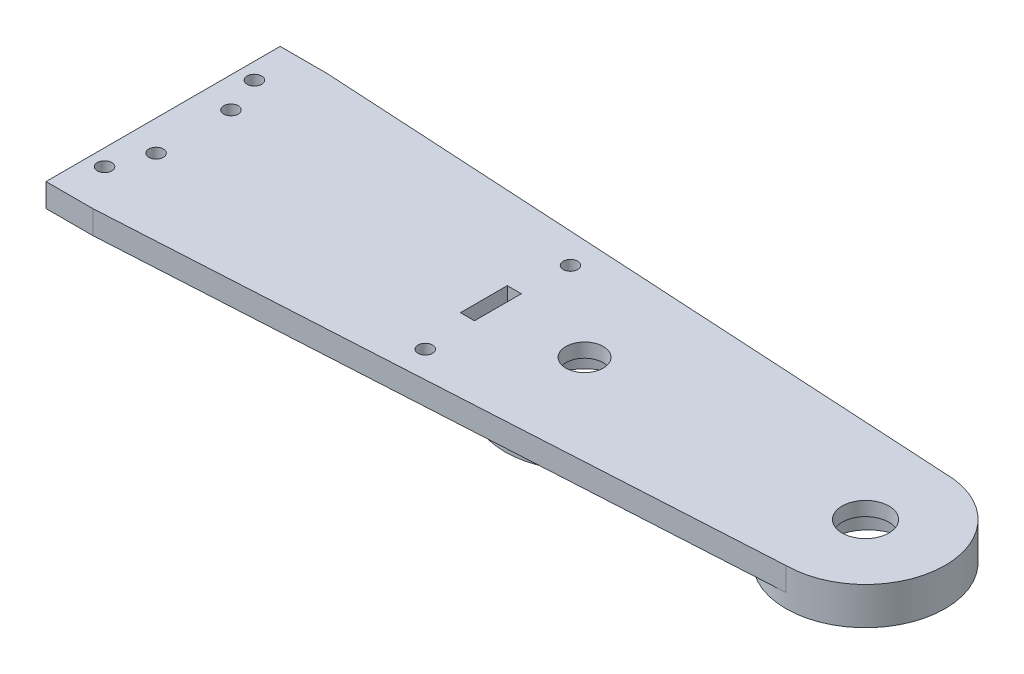
ISO-10303-21;
HEADER;
FILE_DESCRIPTION(('STEP AP214'),'2;1');
FILE_NAME('part.step','',(''),(''),'','','');
FILE_SCHEMA(('AUTOMOTIVE_DESIGN { 1 0 10303 214 1 1 1 1 }'));
ENDSEC;
DATA;
#1=APPLICATION_CONTEXT('core data for automotive mechanical design processes');
#2=APPLICATION_PROTOCOL_DEFINITION('international standard','automotive_design',2000,#1);
#3=PRODUCT_CONTEXT('',#1,'mechanical');
#4=PRODUCT('Part','Part','',(#3));
#5=PRODUCT_RELATED_PRODUCT_CATEGORY('part','',(#4));
#6=PRODUCT_DEFINITION_FORMATION('','',#4);
#7=PRODUCT_DEFINITION_CONTEXT('part definition',#1,'design');
#8=PRODUCT_DEFINITION('design','',#6,#7);
#9=PRODUCT_DEFINITION_SHAPE('','',#8);
#10=(LENGTH_UNIT() NAMED_UNIT(*) SI_UNIT(.MILLI.,.METRE.));
#11=(NAMED_UNIT(*) PLANE_ANGLE_UNIT() SI_UNIT($,.RADIAN.));
#12=(NAMED_UNIT(*) SI_UNIT($,.STERADIAN.) SOLID_ANGLE_UNIT());
#13=UNCERTAINTY_MEASURE_WITH_UNIT(LENGTH_MEASURE(1.E-05),#10,'distance_accuracy_value','');
#14=(GEOMETRIC_REPRESENTATION_CONTEXT(3) GLOBAL_UNCERTAINTY_ASSIGNED_CONTEXT((#13)) GLOBAL_UNIT_ASSIGNED_CONTEXT((#10,
#11,#12)) REPRESENTATION_CONTEXT('',''));
#15=CARTESIAN_POINT('',(0.,0.,0.));
#16=DIRECTION('',(0.,0.,1.));
#17=DIRECTION('',(1.,0.,0.));
#18=AXIS2_PLACEMENT_3D('',#15,#16,#17);
#19=CARTESIAN_POINT('',(103.,-5.,0.));
#20=DIRECTION('',(0.,1.,0.));
#21=DIRECTION('',(0.,0.,1.));
#22=AXIS2_PLACEMENT_3D('',#19,#20,#21);
#23=CYLINDRICAL_SURFACE('',#22,5.00000000000001);
#24=CARTESIAN_POINT('',(103.,0.,0.));
#25=DIRECTION('',(0.,-1.,0.));
#26=DIRECTION('',(0.,0.,-1.));
#27=AXIS2_PLACEMENT_3D('',#24,#25,#26);
#28=CIRCLE('',#27,5.00000000000001);
#29=CARTESIAN_POINT('',(103.,0.,-5.00000000000001));
#30=VERTEX_POINT('',#29);
#31=EDGE_CURVE('E204',#30,#30,#28,.T.);
#32=ORIENTED_EDGE('',*,*,#31,.F.);
#33=EDGE_LOOP('',(#32));
#34=FACE_BOUND('',#33,.T.);
#35=CARTESIAN_POINT('',(103.,-3.00000000000001,0.));
#36=DIRECTION('',(0.,-1.,0.));
#37=DIRECTION('',(1.,0.,0.));
#38=AXIS2_PLACEMENT_3D('',#35,#36,#37);
#39=CIRCLE('',#38,5.00000000000001);
#40=CARTESIAN_POINT('',(108.,-3.00000000000001,0.));
#41=VERTEX_POINT('',#40);
#42=EDGE_CURVE('E41',#41,#41,#39,.T.);
#43=ORIENTED_EDGE('',*,*,#42,.T.);
#44=EDGE_LOOP('',(#43));
#45=FACE_BOUND('',#44,.T.);
#46=ADVANCED_FACE('F37',(#34,#45),#23,.F.);
#47=CARTESIAN_POINT('',(43.,-5.,0.));
#48=DIRECTION('',(0.,1.,0.));
#49=DIRECTION('',(0.,0.,1.));
#50=AXIS2_PLACEMENT_3D('',#47,#48,#49);
#51=CYLINDRICAL_SURFACE('',#50,4.);
#52=CARTESIAN_POINT('',(43.,0.,0.));
#53=DIRECTION('',(0.,-1.,0.));
#54=DIRECTION('',(0.,0.,-1.));
#55=AXIS2_PLACEMENT_3D('',#52,#53,#54);
#56=CIRCLE('',#55,4.);
#57=CARTESIAN_POINT('',(43.,0.,-4.));
#58=VERTEX_POINT('',#57);
#59=EDGE_CURVE('E213',#58,#58,#56,.T.);
#60=ORIENTED_EDGE('',*,*,#59,.F.);
#61=EDGE_LOOP('',(#60));
#62=FACE_BOUND('',#61,.T.);
#63=CARTESIAN_POINT('',(43.,-3.,0.));
#64=DIRECTION('',(0.,-1.,0.));
#65=DIRECTION('',(1.,0.,0.));
#66=AXIS2_PLACEMENT_3D('',#63,#64,#65);
#67=CIRCLE('',#66,4.);
#68=CARTESIAN_POINT('',(47.,-3.,0.));
#69=VERTEX_POINT('',#68);
#70=EDGE_CURVE('E149',#69,#69,#67,.T.);
#71=ORIENTED_EDGE('',*,*,#70,.T.);
#72=EDGE_LOOP('',(#71));
#73=FACE_BOUND('',#72,.T.);
#74=ADVANCED_FACE('F280',(#62,#73),#51,.F.);
#75=CARTESIAN_POINT('',(103.,-5.,0.));
#76=DIRECTION('',(0.,1.,0.));
#77=DIRECTION('',(0.,0.,1.));
#78=AXIS2_PLACEMENT_3D('',#75,#76,#77);
#79=PLANE('',#78);
#80=CARTESIAN_POINT('',(43.,-5.,0.));
#81=DIRECTION('',(0.,1.,0.));
#82=DIRECTION('',(0.,0.,1.));
#83=AXIS2_PLACEMENT_3D('',#80,#81,#82);
#84=CIRCLE('',#83,17.);
#85=CARTESIAN_POINT('',(43.,-5.,17.));
#86=VERTEX_POINT('',#85);
#87=EDGE_CURVE('E11',#86,#86,#84,.F.);
#88=ORIENTED_EDGE('',*,*,#87,.F.);
#89=EDGE_LOOP('',(#88));
#90=FACE_BOUND('',#89,.T.);
#91=CARTESIAN_POINT('',(24.5,-5.,15.5));
#92=DIRECTION('',(0.,-1.,0.));
#93=DIRECTION('',(0.,0.,-1.));
#94=AXIS2_PLACEMENT_3D('',#91,#92,#93);
#95=CIRCLE('',#94,1.55);
#96=CARTESIAN_POINT('',(24.5,-5.,13.95));
#97=VERTEX_POINT('',#96);
#98=EDGE_CURVE('E152',#97,#97,#95,.T.);
#99=ORIENTED_EDGE('',*,*,#98,.F.);
#100=EDGE_LOOP('',(#99));
#101=FACE_BOUND('',#100,.T.);
#102=CARTESIAN_POINT('',(24.5,-5.,-15.5));
#103=DIRECTION('',(0.,-1.,0.));
#104=DIRECTION('',(0.,0.,-1.));
#105=AXIS2_PLACEMENT_3D('',#102,#103,#104);
#106=CIRCLE('',#105,1.55);
#107=CARTESIAN_POINT('',(24.5,-5.,-17.05));
#108=VERTEX_POINT('',#107);
#109=EDGE_CURVE('E158',#108,#108,#106,.T.);
#110=ORIENTED_EDGE('',*,*,#109,.F.);
#111=EDGE_LOOP('',(#110));
#112=FACE_BOUND('',#111,.T.);
#113=DIRECTION('',(0.,0.,-1.));
#114=VECTOR('',#113,1.);
#115=CARTESIAN_POINT('',(21.5,-5.,-5.));
#116=LINE('',#115,#114);
#117=CARTESIAN_POINT('',(21.5,-5.,5.));
#118=VERTEX_POINT('',#117);
#119=CARTESIAN_POINT('',(21.5,-5.,-5.));
#120=VERTEX_POINT('',#119);
#121=EDGE_CURVE('E163',#118,#120,#116,.T.);
#122=ORIENTED_EDGE('',*,*,#121,.F.);
#123=DIRECTION('',(-1.,0.,0.));
#124=VECTOR('',#123,1.);
#125=CARTESIAN_POINT('',(21.5,-5.,5.));
#126=LINE('',#125,#124);
#127=CARTESIAN_POINT('',(24.5,-5.,5.));
#128=VERTEX_POINT('',#127);
#129=EDGE_CURVE('E170',#128,#118,#126,.T.);
#130=ORIENTED_EDGE('',*,*,#129,.F.);
#131=DIRECTION('',(0.,0.,1.));
#132=VECTOR('',#131,1.);
#133=CARTESIAN_POINT('',(24.5,-5.,5.));
#134=LINE('',#133,#132);
#135=CARTESIAN_POINT('',(24.5,-5.,-5.));
#136=VERTEX_POINT('',#135);
#137=EDGE_CURVE('E168',#136,#128,#134,.T.);
#138=ORIENTED_EDGE('',*,*,#137,.F.);
#139=DIRECTION('',(1.,0.,0.));
#140=VECTOR('',#139,1.);
#141=CARTESIAN_POINT('',(24.5,-5.,-5.));
#142=LINE('',#141,#140);
#143=EDGE_CURVE('E165',#120,#136,#142,.T.);
#144=ORIENTED_EDGE('',*,*,#143,.F.);
#145=EDGE_LOOP('',(#122,#130,#138,#144));
#146=FACE_BOUND('',#145,.T.);
#147=CARTESIAN_POINT('',(-40.5,-5.,8.00000000000001));
#148=DIRECTION('',(0.,-1.,0.));
#149=DIRECTION('',(0.,0.,-1.));
#150=AXIS2_PLACEMENT_3D('',#147,#148,#149);
#151=CIRCLE('',#150,1.55);
#152=CARTESIAN_POINT('',(-40.5,-5.,6.45000000000001));
#153=VERTEX_POINT('',#152);
#154=EDGE_CURVE('E210',#153,#153,#151,.T.);
#155=ORIENTED_EDGE('',*,*,#154,.F.);
#156=EDGE_LOOP('',(#155));
#157=FACE_BOUND('',#156,.T.);
#158=CARTESIAN_POINT('',(-40.5,-5.,-7.99999999999999));
#159=DIRECTION('',(0.,-1.,0.));
#160=DIRECTION('',(0.,0.,-1.));
#161=AXIS2_PLACEMENT_3D('',#158,#159,#160);
#162=CIRCLE('',#161,1.55);
#163=CARTESIAN_POINT('',(-40.5,-5.,-9.54999999999999));
#164=VERTEX_POINT('',#163);
#165=EDGE_CURVE('E201',#164,#164,#162,.T.);
#166=ORIENTED_EDGE('',*,*,#165,.F.);
#167=EDGE_LOOP('',(#166));
#168=FACE_BOUND('',#167,.T.);
#169=CARTESIAN_POINT('',(-43.5,-5.,16.));
#170=DIRECTION('',(0.,-1.,0.));
#171=DIRECTION('',(0.,0.,-1.));
#172=AXIS2_PLACEMENT_3D('',#169,#170,#171);
#173=CIRCLE('',#172,1.55);
#174=CARTESIAN_POINT('',(-43.5,-5.,14.45));
#175=VERTEX_POINT('',#174);
#176=EDGE_CURVE('E195',#175,#175,#173,.T.);
#177=ORIENTED_EDGE('',*,*,#176,.F.);
#178=EDGE_LOOP('',(#177));
#179=FACE_BOUND('',#178,.T.);
#180=CARTESIAN_POINT('',(-43.5,-5.,-16.));
#181=DIRECTION('',(0.,-1.,0.));
#182=DIRECTION('',(0.,0.,-1.));
#183=AXIS2_PLACEMENT_3D('',#180,#181,#182);
#184=CIRCLE('',#183,1.55);
#185=CARTESIAN_POINT('',(-43.5,-5.,-17.55));
#186=VERTEX_POINT('',#185);
#187=EDGE_CURVE('E189',#186,#186,#184,.T.);
#188=ORIENTED_EDGE('',*,*,#187,.F.);
#189=EDGE_LOOP('',(#188));
#190=FACE_BOUND('',#189,.T.);
#191=CARTESIAN_POINT('',(103.,-5.00000000000001,0.));
#192=DIRECTION('',(0.,-1.,0.));
#193=DIRECTION('',(1.,0.,0.));
#194=AXIS2_PLACEMENT_3D('',#191,#192,#193);
#195=CIRCLE('',#194,17.);
#196=CARTESIAN_POINT('',(103.,-5.00000000000001,17.));
#197=VERTEX_POINT('',#196);
#198=CARTESIAN_POINT('',(103.,-5.,-17.));
#199=VERTEX_POINT('',#198);
#200=EDGE_CURVE('E136',#197,#199,#195,.T.);
#201=ORIENTED_EDGE('',*,*,#200,.F.);
#202=DIRECTION('',(-0.998371334423977,0.,0.057049790538513));
#203=VECTOR('',#202,1.);
#204=CARTESIAN_POINT('',(103.,-5.,17.));
#205=LINE('',#204,#203);
#206=CARTESIAN_POINT('',(-37.,-5.,25.));
#207=VERTEX_POINT('',#206);
#208=EDGE_CURVE('E118',#197,#207,#205,.T.);
#209=ORIENTED_EDGE('',*,*,#208,.T.);
#210=DIRECTION('',(-1.,0.,0.));
#211=VECTOR('',#210,1.);
#212=CARTESIAN_POINT('',(-47.,-5.,25.));
#213=LINE('',#212,#211);
#214=CARTESIAN_POINT('',(-47.,-5.,25.));
#215=VERTEX_POINT('',#214);
#216=EDGE_CURVE('E128',#207,#215,#213,.T.);
#217=ORIENTED_EDGE('',*,*,#216,.T.);
#218=DIRECTION('',(0.,0.,-1.));
#219=VECTOR('',#218,1.);
#220=CARTESIAN_POINT('',(-47.,-5.,-25.));
#221=LINE('',#220,#219);
#222=CARTESIAN_POINT('',(-47.,-5.,-25.));
#223=VERTEX_POINT('',#222);
#224=EDGE_CURVE('E222',#215,#223,#221,.T.);
#225=ORIENTED_EDGE('',*,*,#224,.T.);
#226=DIRECTION('',(1.,0.,0.));
#227=VECTOR('',#226,1.);
#228=CARTESIAN_POINT('',(-47.,-5.,-25.));
#229=LINE('',#228,#227);
#230=CARTESIAN_POINT('',(-37.,-5.,-25.));
#231=VERTEX_POINT('',#230);
#232=EDGE_CURVE('E224',#223,#231,#229,.T.);
#233=ORIENTED_EDGE('',*,*,#232,.T.);
#234=DIRECTION('',(0.998371334423977,0.,0.0570497905385129));
#235=VECTOR('',#234,1.);
#236=CARTESIAN_POINT('',(-37.,-5.,-25.));
#237=LINE('',#236,#235);
#238=EDGE_CURVE('E129',#231,#199,#237,.T.);
#239=ORIENTED_EDGE('',*,*,#238,.T.);
#240=EDGE_LOOP('',(#201,#209,#217,#225,#233,#239));
#241=FACE_BOUND('',#240,.T.);
#242=ADVANCED_FACE('F139',(#90,#101,#112,#146,#157,#168,#179,#190,#241),#79,.F.);
#243=CARTESIAN_POINT('',(103.,0.,0.));
#244=DIRECTION('',(0.,1.,0.));
#245=DIRECTION('',(0.,0.,1.));
#246=AXIS2_PLACEMENT_3D('',#243,#244,#245);
#247=PLANE('',#246);
#248=CARTESIAN_POINT('',(24.5,0.,-15.5));
#249=DIRECTION('',(0.,-1.,0.));
#250=DIRECTION('',(0.,0.,-1.));
#251=AXIS2_PLACEMENT_3D('',#248,#249,#250);
#252=CIRCLE('',#251,1.55);
#253=CARTESIAN_POINT('',(24.5,0.,-17.05));
#254=VERTEX_POINT('',#253);
#255=EDGE_CURVE('E155',#254,#254,#252,.T.);
#256=ORIENTED_EDGE('',*,*,#255,.T.);
#257=EDGE_LOOP('',(#256));
#258=FACE_BOUND('',#257,.T.);
#259=CARTESIAN_POINT('',(-43.5,0.,16.));
#260=DIRECTION('',(0.,-1.,0.));
#261=DIRECTION('',(0.,0.,-1.));
#262=AXIS2_PLACEMENT_3D('',#259,#260,#261);
#263=CIRCLE('',#262,1.55);
#264=CARTESIAN_POINT('',(-43.5,0.,14.45));
#265=VERTEX_POINT('',#264);
#266=EDGE_CURVE('E192',#265,#265,#263,.T.);
#267=ORIENTED_EDGE('',*,*,#266,.T.);
#268=EDGE_LOOP('',(#267));
#269=FACE_BOUND('',#268,.T.);
#270=ORIENTED_EDGE('',*,*,#31,.T.);
#271=EDGE_LOOP('',(#270));
#272=FACE_BOUND('',#271,.T.);
#273=ORIENTED_EDGE('',*,*,#59,.T.);
#274=EDGE_LOOP('',(#273));
#275=FACE_BOUND('',#274,.T.);
#276=DIRECTION('',(0.998371334423977,0.,0.0570497905385129));
#277=VECTOR('',#276,1.);
#278=CARTESIAN_POINT('',(-37.,0.,-25.));
#279=LINE('',#278,#277);
#280=CARTESIAN_POINT('',(-37.,0.,-25.));
#281=VERTEX_POINT('',#280);
#282=CARTESIAN_POINT('',(103.,0.,-17.));
#283=VERTEX_POINT('',#282);
#284=EDGE_CURVE('E218',#281,#283,#279,.T.);
#285=ORIENTED_EDGE('',*,*,#284,.F.);
#286=DIRECTION('',(1.,0.,0.));
#287=VECTOR('',#286,1.);
#288=CARTESIAN_POINT('',(-47.,0.,-25.));
#289=LINE('',#288,#287);
#290=CARTESIAN_POINT('',(-47.,0.,-25.));
#291=VERTEX_POINT('',#290);
#292=EDGE_CURVE('E219',#291,#281,#289,.T.);
#293=ORIENTED_EDGE('',*,*,#292,.F.);
#294=DIRECTION('',(0.,0.,-1.));
#295=VECTOR('',#294,1.);
#296=CARTESIAN_POINT('',(-47.,0.,-25.));
#297=LINE('',#296,#295);
#298=CARTESIAN_POINT('',(-47.,0.,25.));
#299=VERTEX_POINT('',#298);
#300=EDGE_CURVE('E234',#299,#291,#297,.T.);
#301=ORIENTED_EDGE('',*,*,#300,.F.);
#302=DIRECTION('',(-1.,0.,0.));
#303=VECTOR('',#302,1.);
#304=CARTESIAN_POINT('',(-47.,0.,25.));
#305=LINE('',#304,#303);
#306=CARTESIAN_POINT('',(-37.,0.,25.));
#307=VERTEX_POINT('',#306);
#308=EDGE_CURVE('E232',#307,#299,#305,.T.);
#309=ORIENTED_EDGE('',*,*,#308,.F.);
#310=DIRECTION('',(-0.998371334423977,0.,0.057049790538513));
#311=VECTOR('',#310,1.);
#312=CARTESIAN_POINT('',(103.,0.,17.));
#313=LINE('',#312,#311);
#314=CARTESIAN_POINT('',(103.,0.,17.));
#315=VERTEX_POINT('',#314);
#316=EDGE_CURVE('E230',#315,#307,#313,.T.);
#317=ORIENTED_EDGE('',*,*,#316,.F.);
#318=CARTESIAN_POINT('',(103.,0.,0.));
#319=DIRECTION('',(0.,-1.,0.));
#320=DIRECTION('',(0.,0.,1.));
#321=AXIS2_PLACEMENT_3D('',#318,#319,#320);
#322=CIRCLE('',#321,17.);
#323=EDGE_CURVE('E137',#283,#315,#322,.T.);
#324=ORIENTED_EDGE('',*,*,#323,.F.);
#325=EDGE_LOOP('',(#285,#293,#301,#309,#317,#324));
#326=FACE_BOUND('',#325,.T.);
#327=CARTESIAN_POINT('',(-40.5,0.,8.00000000000001));
#328=DIRECTION('',(0.,-1.,0.));
#329=DIRECTION('',(0.,0.,-1.));
#330=AXIS2_PLACEMENT_3D('',#327,#328,#329);
#331=CIRCLE('',#330,1.55);
#332=CARTESIAN_POINT('',(-40.5,0.,6.45000000000001));
#333=VERTEX_POINT('',#332);
#334=EDGE_CURVE('E209',#333,#333,#331,.T.);
#335=ORIENTED_EDGE('',*,*,#334,.T.);
#336=EDGE_LOOP('',(#335));
#337=FACE_BOUND('',#336,.T.);
#338=CARTESIAN_POINT('',(-40.5,0.,-7.99999999999999));
#339=DIRECTION('',(0.,-1.,0.));
#340=DIRECTION('',(0.,0.,-1.));
#341=AXIS2_PLACEMENT_3D('',#338,#339,#340);
#342=CIRCLE('',#341,1.55);
#343=CARTESIAN_POINT('',(-40.5,0.,-9.54999999999999));
#344=VERTEX_POINT('',#343);
#345=EDGE_CURVE('E198',#344,#344,#342,.T.);
#346=ORIENTED_EDGE('',*,*,#345,.T.);
#347=EDGE_LOOP('',(#346));
#348=FACE_BOUND('',#347,.T.);
#349=CARTESIAN_POINT('',(-43.5,0.,-16.));
#350=DIRECTION('',(0.,-1.,0.));
#351=DIRECTION('',(0.,0.,-1.));
#352=AXIS2_PLACEMENT_3D('',#349,#350,#351);
#353=CIRCLE('',#352,1.55);
#354=CARTESIAN_POINT('',(-43.5,0.,-17.55));
#355=VERTEX_POINT('',#354);
#356=EDGE_CURVE('E188',#355,#355,#353,.T.);
#357=ORIENTED_EDGE('',*,*,#356,.T.);
#358=EDGE_LOOP('',(#357));
#359=FACE_BOUND('',#358,.T.);
#360=DIRECTION('',(-1.,0.,0.));
#361=VECTOR('',#360,1.);
#362=CARTESIAN_POINT('',(21.5,0.,5.));
#363=LINE('',#362,#361);
#364=CARTESIAN_POINT('',(24.5,0.,5.));
#365=VERTEX_POINT('',#364);
#366=CARTESIAN_POINT('',(21.5,0.,5.));
#367=VERTEX_POINT('',#366);
#368=EDGE_CURVE('E166',#365,#367,#363,.T.);
#369=ORIENTED_EDGE('',*,*,#368,.T.);
#370=DIRECTION('',(0.,0.,-1.));
#371=VECTOR('',#370,1.);
#372=CARTESIAN_POINT('',(21.5,0.,-5.));
#373=LINE('',#372,#371);
#374=CARTESIAN_POINT('',(21.5,0.,-5.));
#375=VERTEX_POINT('',#374);
#376=EDGE_CURVE('E62',#367,#375,#373,.T.);
#377=ORIENTED_EDGE('',*,*,#376,.T.);
#378=DIRECTION('',(1.,0.,0.));
#379=VECTOR('',#378,1.);
#380=CARTESIAN_POINT('',(24.5,0.,-5.));
#381=LINE('',#380,#379);
#382=CARTESIAN_POINT('',(24.5,0.,-5.));
#383=VERTEX_POINT('',#382);
#384=EDGE_CURVE('E174',#375,#383,#381,.T.);
#385=ORIENTED_EDGE('',*,*,#384,.T.);
#386=DIRECTION('',(0.,0.,1.));
#387=VECTOR('',#386,1.);
#388=CARTESIAN_POINT('',(24.5,0.,5.));
#389=LINE('',#388,#387);
#390=EDGE_CURVE('E177',#383,#365,#389,.T.);
#391=ORIENTED_EDGE('',*,*,#390,.T.);
#392=EDGE_LOOP('',(#369,#377,#385,#391));
#393=FACE_BOUND('',#392,.T.);
#394=CARTESIAN_POINT('',(24.5,0.,15.5));
#395=DIRECTION('',(0.,-1.,0.));
#396=DIRECTION('',(0.,0.,-1.));
#397=AXIS2_PLACEMENT_3D('',#394,#395,#396);
#398=CIRCLE('',#397,1.55);
#399=CARTESIAN_POINT('',(24.5,0.,13.95));
#400=VERTEX_POINT('',#399);
#401=EDGE_CURVE('E146',#400,#400,#398,.T.);
#402=ORIENTED_EDGE('',*,*,#401,.T.);
#403=EDGE_LOOP('',(#402));
#404=FACE_BOUND('',#403,.T.);
#405=ADVANCED_FACE('F300',(#258,#269,#272,#275,#326,#337,#348,#359,#393,#404),#247,.T.);
#406=CARTESIAN_POINT('',(-37.,-5.,-25.));
#407=DIRECTION('',(-0.0570497905385129,0.,0.998371334423977));
#408=DIRECTION('',(0.998371334423977,0.,0.0570497905385129));
#409=AXIS2_PLACEMENT_3D('',#406,#407,#408);
#410=PLANE('',#409);
#411=ORIENTED_EDGE('',*,*,#284,.T.);
#412=DIRECTION('',(0.,1.,0.));
#413=VECTOR('',#412,1.);
#414=CARTESIAN_POINT('',(103.,-5.,-17.));
#415=LINE('',#414,#413);
#416=EDGE_CURVE('E46',#199,#283,#415,.T.);
#417=ORIENTED_EDGE('',*,*,#416,.F.);
#418=ORIENTED_EDGE('',*,*,#238,.F.);
#419=DIRECTION('',(0.,1.,0.));
#420=VECTOR('',#419,1.);
#421=CARTESIAN_POINT('',(-37.,-5.,-25.));
#422=LINE('',#421,#420);
#423=EDGE_CURVE('E226',#231,#281,#422,.T.);
#424=ORIENTED_EDGE('',*,*,#423,.T.);
#425=EDGE_LOOP('',(#411,#417,#418,#424));
#426=FACE_BOUND('',#425,.T.);
#427=ADVANCED_FACE('F39',(#426),#410,.F.);
#428=CARTESIAN_POINT('',(103.,-5.,0.));
#429=DIRECTION('',(0.,1.,0.));
#430=DIRECTION('',(0.,0.,1.));
#431=AXIS2_PLACEMENT_3D('',#428,#429,#430);
#432=CYLINDRICAL_SURFACE('',#431,17.);
#433=ORIENTED_EDGE('',*,*,#323,.T.);
#434=DIRECTION('',(0.,1.,0.));
#435=VECTOR('',#434,1.);
#436=CARTESIAN_POINT('',(103.,-5.,17.));
#437=LINE('',#436,#435);
#438=EDGE_CURVE('E121',#197,#315,#437,.T.);
#439=ORIENTED_EDGE('',*,*,#438,.F.);
#440=ORIENTED_EDGE('',*,*,#200,.T.);
#441=ORIENTED_EDGE('',*,*,#416,.T.);
#442=EDGE_LOOP('',(#433,#439,#440,#441));
#443=FACE_BOUND('',#442,.T.);
#444=CARTESIAN_POINT('',(103.,-8.00000000000001,0.));
#445=DIRECTION('',(0.,-1.,0.));
#446=DIRECTION('',(1.,0.,0.));
#447=AXIS2_PLACEMENT_3D('',#444,#445,#446);
#448=CIRCLE('',#447,17.);
#449=CARTESIAN_POINT('',(120.,-8.00000000000001,0.));
#450=VERTEX_POINT('',#449);
#451=EDGE_CURVE('E142',#450,#450,#448,.T.);
#452=ORIENTED_EDGE('',*,*,#451,.F.);
#453=EDGE_LOOP('',(#452));
#454=FACE_BOUND('',#453,.T.);
#455=ADVANCED_FACE('F133',(#443,#454),#432,.T.);
#456=CARTESIAN_POINT('',(103.,-5.,17.));
#457=DIRECTION('',(-0.057049790538513,0.,-0.998371334423977));
#458=DIRECTION('',(-0.998371334423977,0.,0.057049790538513));
#459=AXIS2_PLACEMENT_3D('',#456,#457,#458);
#460=PLANE('',#459);
#461=ORIENTED_EDGE('',*,*,#316,.T.);
#462=DIRECTION('',(0.,1.,0.));
#463=VECTOR('',#462,1.);
#464=CARTESIAN_POINT('',(-37.,-5.,25.));
#465=LINE('',#464,#463);
#466=EDGE_CURVE('E124',#207,#307,#465,.T.);
#467=ORIENTED_EDGE('',*,*,#466,.F.);
#468=ORIENTED_EDGE('',*,*,#208,.F.);
#469=ORIENTED_EDGE('',*,*,#438,.T.);
#470=EDGE_LOOP('',(#461,#467,#468,#469));
#471=FACE_BOUND('',#470,.T.);
#472=ADVANCED_FACE('F120',(#471),#460,.F.);
#473=CARTESIAN_POINT('',(-47.,-5.,25.));
#474=DIRECTION('',(0.,0.,-1.));
#475=DIRECTION('',(-1.,0.,0.));
#476=AXIS2_PLACEMENT_3D('',#473,#474,#475);
#477=PLANE('',#476);
#478=ORIENTED_EDGE('',*,*,#308,.T.);
#479=DIRECTION('',(0.,1.,0.));
#480=VECTOR('',#479,1.);
#481=CARTESIAN_POINT('',(-47.,-5.,25.));
#482=LINE('',#481,#480);
#483=EDGE_CURVE('E242',#215,#299,#482,.T.);
#484=ORIENTED_EDGE('',*,*,#483,.F.);
#485=ORIENTED_EDGE('',*,*,#216,.F.);
#486=ORIENTED_EDGE('',*,*,#466,.T.);
#487=EDGE_LOOP('',(#478,#484,#485,#486));
#488=FACE_BOUND('',#487,.T.);
#489=ADVANCED_FACE('F311',(#488),#477,.F.);
#490=CARTESIAN_POINT('',(-47.,-5.,-25.));
#491=DIRECTION('',(1.,0.,0.));
#492=DIRECTION('',(0.,0.,-1.));
#493=AXIS2_PLACEMENT_3D('',#490,#491,#492);
#494=PLANE('',#493);
#495=ORIENTED_EDGE('',*,*,#300,.T.);
#496=DIRECTION('',(0.,1.,0.));
#497=VECTOR('',#496,1.);
#498=CARTESIAN_POINT('',(-47.,-5.,-25.));
#499=LINE('',#498,#497);
#500=EDGE_CURVE('E239',#223,#291,#499,.T.);
#501=ORIENTED_EDGE('',*,*,#500,.F.);
#502=ORIENTED_EDGE('',*,*,#224,.F.);
#503=ORIENTED_EDGE('',*,*,#483,.T.);
#504=EDGE_LOOP('',(#495,#501,#502,#503));
#505=FACE_BOUND('',#504,.T.);
#506=ADVANCED_FACE('F307',(#505),#494,.F.);
#507=CARTESIAN_POINT('',(-47.,-5.,-25.));
#508=DIRECTION('',(0.,0.,1.));
#509=DIRECTION('',(1.,0.,0.));
#510=AXIS2_PLACEMENT_3D('',#507,#508,#509);
#511=PLANE('',#510);
#512=ORIENTED_EDGE('',*,*,#292,.T.);
#513=ORIENTED_EDGE('',*,*,#423,.F.);
#514=ORIENTED_EDGE('',*,*,#232,.F.);
#515=ORIENTED_EDGE('',*,*,#500,.T.);
#516=EDGE_LOOP('',(#512,#513,#514,#515));
#517=FACE_BOUND('',#516,.T.);
#518=ADVANCED_FACE('F295',(#517),#511,.F.);
#519=CARTESIAN_POINT('',(-40.5,-5.,8.00000000000001));
#520=DIRECTION('',(0.,1.,0.));
#521=DIRECTION('',(0.,0.,1.));
#522=AXIS2_PLACEMENT_3D('',#519,#520,#521);
#523=CYLINDRICAL_SURFACE('',#522,1.55);
#524=ORIENTED_EDGE('',*,*,#154,.T.);
#525=EDGE_LOOP('',(#524));
#526=FACE_BOUND('',#525,.T.);
#527=ORIENTED_EDGE('',*,*,#334,.F.);
#528=EDGE_LOOP('',(#527));
#529=FACE_BOUND('',#528,.T.);
#530=ADVANCED_FACE('F293',(#526,#529),#523,.F.);
#531=CARTESIAN_POINT('',(-40.5,-5.,-7.99999999999999));
#532=DIRECTION('',(0.,1.,0.));
#533=DIRECTION('',(0.,0.,1.));
#534=AXIS2_PLACEMENT_3D('',#531,#532,#533);
#535=CYLINDRICAL_SURFACE('',#534,1.55);
#536=ORIENTED_EDGE('',*,*,#165,.T.);
#537=EDGE_LOOP('',(#536));
#538=FACE_BOUND('',#537,.T.);
#539=ORIENTED_EDGE('',*,*,#345,.F.);
#540=EDGE_LOOP('',(#539));
#541=FACE_BOUND('',#540,.T.);
#542=ADVANCED_FACE('F291',(#538,#541),#535,.F.);
#543=CARTESIAN_POINT('',(-43.5,-5.,16.));
#544=DIRECTION('',(0.,1.,0.));
#545=DIRECTION('',(0.,0.,1.));
#546=AXIS2_PLACEMENT_3D('',#543,#544,#545);
#547=CYLINDRICAL_SURFACE('',#546,1.55);
#548=ORIENTED_EDGE('',*,*,#176,.T.);
#549=EDGE_LOOP('',(#548));
#550=FACE_BOUND('',#549,.T.);
#551=ORIENTED_EDGE('',*,*,#266,.F.);
#552=EDGE_LOOP('',(#551));
#553=FACE_BOUND('',#552,.T.);
#554=ADVANCED_FACE('F377',(#550,#553),#547,.F.);
#555=CARTESIAN_POINT('',(-43.5,-5.,-16.));
#556=DIRECTION('',(0.,1.,0.));
#557=DIRECTION('',(0.,0.,1.));
#558=AXIS2_PLACEMENT_3D('',#555,#556,#557);
#559=CYLINDRICAL_SURFACE('',#558,1.55);
#560=ORIENTED_EDGE('',*,*,#187,.T.);
#561=EDGE_LOOP('',(#560));
#562=FACE_BOUND('',#561,.T.);
#563=ORIENTED_EDGE('',*,*,#356,.F.);
#564=EDGE_LOOP('',(#563));
#565=FACE_BOUND('',#564,.T.);
#566=ADVANCED_FACE('F375',(#562,#565),#559,.F.);
#567=CARTESIAN_POINT('',(21.5,-5.,-5.));
#568=DIRECTION('',(1.,0.,0.));
#569=DIRECTION('',(0.,0.,-1.));
#570=AXIS2_PLACEMENT_3D('',#567,#568,#569);
#571=PLANE('',#570);
#572=ORIENTED_EDGE('',*,*,#376,.F.);
#573=DIRECTION('',(0.,1.,0.));
#574=VECTOR('',#573,1.);
#575=CARTESIAN_POINT('',(21.5,-5.,5.));
#576=LINE('',#575,#574);
#577=EDGE_CURVE('E172',#118,#367,#576,.T.);
#578=ORIENTED_EDGE('',*,*,#577,.F.);
#579=ORIENTED_EDGE('',*,*,#121,.T.);
#580=DIRECTION('',(0.,1.,0.));
#581=VECTOR('',#580,1.);
#582=CARTESIAN_POINT('',(21.5,-5.,-5.));
#583=LINE('',#582,#581);
#584=EDGE_CURVE('E186',#120,#375,#583,.T.);
#585=ORIENTED_EDGE('',*,*,#584,.T.);
#586=EDGE_LOOP('',(#572,#578,#579,#585));
#587=FACE_BOUND('',#586,.T.);
#588=ADVANCED_FACE('F371',(#587),#571,.T.);
#589=CARTESIAN_POINT('',(24.5,-5.,-5.));
#590=DIRECTION('',(0.,0.,1.));
#591=DIRECTION('',(1.,0.,0.));
#592=AXIS2_PLACEMENT_3D('',#589,#590,#591);
#593=PLANE('',#592);
#594=ORIENTED_EDGE('',*,*,#384,.F.);
#595=ORIENTED_EDGE('',*,*,#584,.F.);
#596=ORIENTED_EDGE('',*,*,#143,.T.);
#597=DIRECTION('',(0.,1.,0.));
#598=VECTOR('',#597,1.);
#599=CARTESIAN_POINT('',(24.5,-5.,-5.));
#600=LINE('',#599,#598);
#601=EDGE_CURVE('E184',#136,#383,#600,.T.);
#602=ORIENTED_EDGE('',*,*,#601,.T.);
#603=EDGE_LOOP('',(#594,#595,#596,#602));
#604=FACE_BOUND('',#603,.T.);
#605=ADVANCED_FACE('F367',(#604),#593,.T.);
#606=CARTESIAN_POINT('',(24.5,-5.,5.));
#607=DIRECTION('',(-1.,0.,0.));
#608=DIRECTION('',(0.,0.,1.));
#609=AXIS2_PLACEMENT_3D('',#606,#607,#608);
#610=PLANE('',#609);
#611=ORIENTED_EDGE('',*,*,#390,.F.);
#612=ORIENTED_EDGE('',*,*,#601,.F.);
#613=ORIENTED_EDGE('',*,*,#137,.T.);
#614=DIRECTION('',(0.,1.,0.));
#615=VECTOR('',#614,1.);
#616=CARTESIAN_POINT('',(24.5,-5.,5.));
#617=LINE('',#616,#615);
#618=EDGE_CURVE('E54',#128,#365,#617,.T.);
#619=ORIENTED_EDGE('',*,*,#618,.T.);
#620=EDGE_LOOP('',(#611,#612,#613,#619));
#621=FACE_BOUND('',#620,.T.);
#622=ADVANCED_FACE('F364',(#621),#610,.T.);
#623=CARTESIAN_POINT('',(21.5,-5.,5.));
#624=DIRECTION('',(0.,0.,-1.));
#625=DIRECTION('',(-1.,0.,0.));
#626=AXIS2_PLACEMENT_3D('',#623,#624,#625);
#627=PLANE('',#626);
#628=ORIENTED_EDGE('',*,*,#368,.F.);
#629=ORIENTED_EDGE('',*,*,#618,.F.);
#630=ORIENTED_EDGE('',*,*,#129,.T.);
#631=ORIENTED_EDGE('',*,*,#577,.T.);
#632=EDGE_LOOP('',(#628,#629,#630,#631));
#633=FACE_BOUND('',#632,.T.);
#634=ADVANCED_FACE('F357',(#633),#627,.T.);
#635=CARTESIAN_POINT('',(24.5,-5.,-15.5));
#636=DIRECTION('',(0.,1.,0.));
#637=DIRECTION('',(0.,0.,1.));
#638=AXIS2_PLACEMENT_3D('',#635,#636,#637);
#639=CYLINDRICAL_SURFACE('',#638,1.55);
#640=ORIENTED_EDGE('',*,*,#109,.T.);
#641=EDGE_LOOP('',(#640));
#642=FACE_BOUND('',#641,.T.);
#643=ORIENTED_EDGE('',*,*,#255,.F.);
#644=EDGE_LOOP('',(#643));
#645=FACE_BOUND('',#644,.T.);
#646=ADVANCED_FACE('F347',(#642,#645),#639,.F.);
#647=CARTESIAN_POINT('',(24.5,-5.,15.5));
#648=DIRECTION('',(0.,1.,0.));
#649=DIRECTION('',(0.,0.,1.));
#650=AXIS2_PLACEMENT_3D('',#647,#648,#649);
#651=CYLINDRICAL_SURFACE('',#650,1.55);
#652=ORIENTED_EDGE('',*,*,#98,.T.);
#653=EDGE_LOOP('',(#652));
#654=FACE_BOUND('',#653,.T.);
#655=ORIENTED_EDGE('',*,*,#401,.F.);
#656=EDGE_LOOP('',(#655));
#657=FACE_BOUND('',#656,.T.);
#658=ADVANCED_FACE('F344',(#654,#657),#651,.F.);
#659=CARTESIAN_POINT('',(103.,-8.00000000000001,0.));
#660=DIRECTION('',(0.,-1.,0.));
#661=DIRECTION('',(1.,0.,0.));
#662=AXIS2_PLACEMENT_3D('',#659,#660,#661);
#663=PLANE('',#662);
#664=CARTESIAN_POINT('',(103.,-8.00000000000001,-0.549344367868798));
#665=DIRECTION('',(0.,-1.,0.));
#666=DIRECTION('',(1.,0.,0.));
#667=AXIS2_PLACEMENT_3D('',#664,#665,#666);
#668=CIRCLE('',#667,8.2);
#669=CARTESIAN_POINT('',(111.2,-8.00000000000001,-0.549344367868798));
#670=VERTEX_POINT('',#669);
#671=EDGE_CURVE('E258',#670,#670,#668,.T.);
#672=ORIENTED_EDGE('',*,*,#671,.F.);
#673=EDGE_LOOP('',(#672));
#674=FACE_BOUND('',#673,.T.);
#675=ORIENTED_EDGE('',*,*,#451,.T.);
#676=EDGE_LOOP('',(#675));
#677=FACE_BOUND('',#676,.T.);
#678=ADVANCED_FACE('F346',(#674,#677),#663,.T.);
#679=CARTESIAN_POINT('',(43.,-9.00000000000001,0.));
#680=DIRECTION('',(0.,1.,0.));
#681=DIRECTION('',(-1.,0.,0.));
#682=AXIS2_PLACEMENT_3D('',#679,#680,#681);
#683=CYLINDRICAL_SURFACE('',#682,17.);
#684=CARTESIAN_POINT('',(43.,-9.00000000000001,0.));
#685=DIRECTION('',(0.,-1.,0.));
#686=DIRECTION('',(1.,0.,0.));
#687=AXIS2_PLACEMENT_3D('',#684,#685,#686);
#688=CIRCLE('',#687,17.);
#689=CARTESIAN_POINT('',(60.,-9.00000000000001,0.));
#690=VERTEX_POINT('',#689);
#691=EDGE_CURVE('E143',#690,#690,#688,.T.);
#692=ORIENTED_EDGE('',*,*,#691,.F.);
#693=EDGE_LOOP('',(#692));
#694=FACE_BOUND('',#693,.T.);
#695=ORIENTED_EDGE('',*,*,#87,.T.);
#696=EDGE_LOOP('',(#695));
#697=FACE_BOUND('',#696,.T.);
#698=ADVANCED_FACE('F354',(#694,#697),#683,.T.);
#699=CARTESIAN_POINT('',(43.,-9.00000000000001,0.));
#700=DIRECTION('',(0.,-1.,0.));
#701=DIRECTION('',(1.,0.,0.));
#702=AXIS2_PLACEMENT_3D('',#699,#700,#701);
#703=PLANE('',#702);
#704=CARTESIAN_POINT('',(43.,-9.00000000000001,0.));
#705=DIRECTION('',(0.,-1.,0.));
#706=DIRECTION('',(1.,0.,0.));
#707=AXIS2_PLACEMENT_3D('',#704,#705,#706);
#708=CIRCLE('',#707,9.7);
#709=CARTESIAN_POINT('',(52.7,-9.00000000000001,0.));
#710=VERTEX_POINT('',#709);
#711=EDGE_CURVE('E251',#710,#710,#708,.T.);
#712=ORIENTED_EDGE('',*,*,#711,.F.);
#713=EDGE_LOOP('',(#712));
#714=FACE_BOUND('',#713,.T.);
#715=ORIENTED_EDGE('',*,*,#691,.T.);
#716=EDGE_LOOP('',(#715));
#717=FACE_BOUND('',#716,.T.);
#718=ADVANCED_FACE('F450',(#714,#717),#703,.T.);
#719=CARTESIAN_POINT('',(43.,-3.,0.));
#720=DIRECTION('',(0.,-1.,0.));
#721=DIRECTION('',(1.,0.,0.));
#722=AXIS2_PLACEMENT_3D('',#719,#720,#721);
#723=CYLINDRICAL_SURFACE('',#722,9.7);
#724=CARTESIAN_POINT('',(43.,-3.,0.));
#725=DIRECTION('',(0.,-1.,0.));
#726=DIRECTION('',(1.,0.,0.));
#727=AXIS2_PLACEMENT_3D('',#724,#725,#726);
#728=CIRCLE('',#727,9.7);
#729=CARTESIAN_POINT('',(52.7,-3.,0.));
#730=VERTEX_POINT('',#729);
#731=EDGE_CURVE('E247',#730,#730,#728,.T.);
#732=ORIENTED_EDGE('',*,*,#731,.F.);
#733=EDGE_LOOP('',(#732));
#734=FACE_BOUND('',#733,.T.);
#735=ORIENTED_EDGE('',*,*,#711,.T.);
#736=EDGE_LOOP('',(#735));
#737=FACE_BOUND('',#736,.T.);
#738=ADVANCED_FACE('F454',(#734,#737),#723,.F.);
#739=CARTESIAN_POINT('',(43.,-3.,0.));
#740=DIRECTION('',(0.,-1.,0.));
#741=DIRECTION('',(1.,0.,0.));
#742=AXIS2_PLACEMENT_3D('',#739,#740,#741);
#743=PLANE('',#742);
#744=ORIENTED_EDGE('',*,*,#70,.F.);
#745=EDGE_LOOP('',(#744));
#746=FACE_BOUND('',#745,.T.);
#747=ORIENTED_EDGE('',*,*,#731,.T.);
#748=EDGE_LOOP('',(#747));
#749=FACE_BOUND('',#748,.T.);
#750=ADVANCED_FACE('F276',(#746,#749),#743,.T.);
#751=CARTESIAN_POINT('',(103.,-3.00000000000001,-0.549344367868798));
#752=DIRECTION('',(0.,-1.,0.));
#753=DIRECTION('',(1.,0.,0.));
#754=AXIS2_PLACEMENT_3D('',#751,#752,#753);
#755=CYLINDRICAL_SURFACE('',#754,8.2);
#756=CARTESIAN_POINT('',(103.,-3.00000000000001,-0.549344367868798));
#757=DIRECTION('',(0.,-1.,0.));
#758=DIRECTION('',(1.,0.,0.));
#759=AXIS2_PLACEMENT_3D('',#756,#757,#758);
#760=CIRCLE('',#759,8.2);
#761=CARTESIAN_POINT('',(111.2,-3.00000000000001,-0.549344367868798));
#762=VERTEX_POINT('',#761);
#763=EDGE_CURVE('E261',#762,#762,#760,.T.);
#764=ORIENTED_EDGE('',*,*,#763,.F.);
#765=EDGE_LOOP('',(#764));
#766=FACE_BOUND('',#765,.T.);
#767=ORIENTED_EDGE('',*,*,#671,.T.);
#768=EDGE_LOOP('',(#767));
#769=FACE_BOUND('',#768,.T.);
#770=ADVANCED_FACE('F271',(#766,#769),#755,.F.);
#771=CARTESIAN_POINT('',(103.,-3.00000000000001,-0.549344367868798));
#772=DIRECTION('',(0.,-1.,0.));
#773=DIRECTION('',(1.,0.,0.));
#774=AXIS2_PLACEMENT_3D('',#771,#772,#773);
#775=PLANE('',#774);
#776=ORIENTED_EDGE('',*,*,#42,.F.);
#777=EDGE_LOOP('',(#776));
#778=FACE_BOUND('',#777,.T.);
#779=ORIENTED_EDGE('',*,*,#763,.T.);
#780=EDGE_LOOP('',(#779));
#781=FACE_BOUND('',#780,.T.);
#782=ADVANCED_FACE('F269',(#778,#781),#775,.T.);
#783=CLOSED_SHELL('',(#46,#74,#242,#405,#427,#455,#472,#489,#506,#518,#530,#542,#554,#566,#588,
#605,#622,#634,#646,#658,#678,#698,#718,#738,#750,#770,#782));
#784=MANIFOLD_SOLID_BREP('B2',#783);
#785=ADVANCED_BREP_SHAPE_REPRESENTATION('',(#18,#784),#14);
#786=SHAPE_DEFINITION_REPRESENTATION(#9,#785);
ENDSEC;
END-ISO-10303-21;
